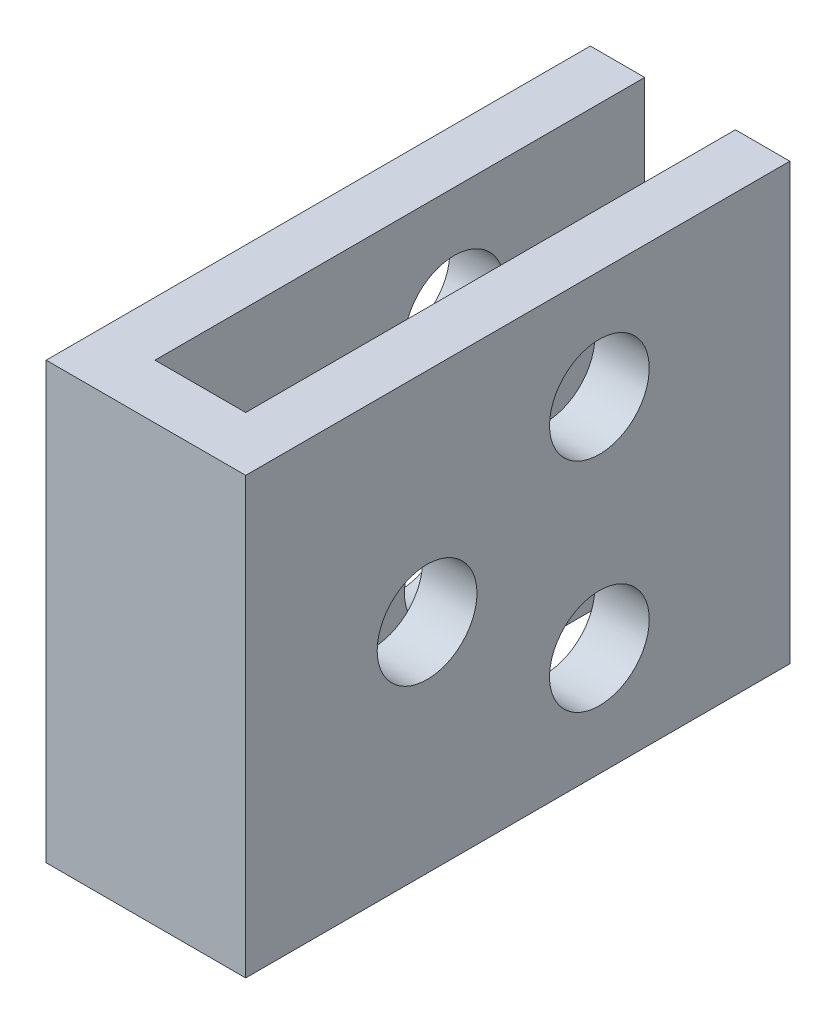
ISO-10303-21;
HEADER;
FILE_DESCRIPTION(('STEP AP214'),'2;1');
FILE_NAME('part.step','',(''),(''),'','','');
FILE_SCHEMA(('AUTOMOTIVE_DESIGN { 1 0 10303 214 1 1 1 1 }'));
ENDSEC;
DATA;
#1=APPLICATION_CONTEXT('core data for automotive mechanical design processes');
#2=APPLICATION_PROTOCOL_DEFINITION('international standard','automotive_design',2000,#1);
#3=PRODUCT_CONTEXT('',#1,'mechanical');
#4=PRODUCT('Part','Part','',(#3));
#5=PRODUCT_RELATED_PRODUCT_CATEGORY('part','',(#4));
#6=PRODUCT_DEFINITION_FORMATION('','',#4);
#7=PRODUCT_DEFINITION_CONTEXT('part definition',#1,'design');
#8=PRODUCT_DEFINITION('design','',#6,#7);
#9=PRODUCT_DEFINITION_SHAPE('','',#8);
#10=(LENGTH_UNIT() NAMED_UNIT(*) SI_UNIT(.MILLI.,.METRE.));
#11=(NAMED_UNIT(*) PLANE_ANGLE_UNIT() SI_UNIT($,.RADIAN.));
#12=(NAMED_UNIT(*) SI_UNIT($,.STERADIAN.) SOLID_ANGLE_UNIT());
#13=UNCERTAINTY_MEASURE_WITH_UNIT(LENGTH_MEASURE(1.E-05),#10,'distance_accuracy_value','');
#14=(GEOMETRIC_REPRESENTATION_CONTEXT(3) GLOBAL_UNCERTAINTY_ASSIGNED_CONTEXT((#13)) GLOBAL_UNIT_ASSIGNED_CONTEXT((#10,
#11,#12)) REPRESENTATION_CONTEXT('',''));
#15=CARTESIAN_POINT('',(0.,0.,0.));
#16=DIRECTION('',(0.,0.,1.));
#17=DIRECTION('',(1.,0.,0.));
#18=AXIS2_PLACEMENT_3D('',#15,#16,#17);
#19=CARTESIAN_POINT('',(-5.5,12.,0.));
#20=DIRECTION('',(1.,0.,0.));
#21=DIRECTION('',(0.,0.,-1.));
#22=AXIS2_PLACEMENT_3D('',#19,#20,#21);
#23=PLANE('',#22);
#24=CARTESIAN_POINT('',(-5.5,6.,-19.5));
#25=DIRECTION('',(-1.,0.,0.));
#26=DIRECTION('',(0.,0.,1.));
#27=AXIS2_PLACEMENT_3D('',#24,#25,#26);
#28=CIRCLE('',#27,2.75);
#29=CARTESIAN_POINT('',(-5.5,6.,-16.75));
#30=VERTEX_POINT('',#29);
#31=EDGE_CURVE('E171',#30,#30,#28,.T.);
#32=ORIENTED_EDGE('',*,*,#31,.F.);
#33=EDGE_LOOP('',(#32));
#34=FACE_BOUND('',#33,.T.);
#35=CARTESIAN_POINT('',(-5.5,-6.,-19.5));
#36=DIRECTION('',(-1.,0.,0.));
#37=DIRECTION('',(0.,0.,-1.));
#38=AXIS2_PLACEMENT_3D('',#35,#36,#37);
#39=CIRCLE('',#38,2.75);
#40=CARTESIAN_POINT('',(-5.5,-6.,-22.25));
#41=VERTEX_POINT('',#40);
#42=EDGE_CURVE('E181',#41,#41,#39,.T.);
#43=ORIENTED_EDGE('',*,*,#42,.F.);
#44=EDGE_LOOP('',(#43));
#45=FACE_BOUND('',#44,.T.);
#46=CARTESIAN_POINT('',(-5.5,0.,-10.));
#47=DIRECTION('',(-1.,0.,0.));
#48=DIRECTION('',(0.,0.,1.));
#49=AXIS2_PLACEMENT_3D('',#46,#47,#48);
#50=CIRCLE('',#49,2.75);
#51=CARTESIAN_POINT('',(-5.5,0.,-7.25));
#52=VERTEX_POINT('',#51);
#53=EDGE_CURVE('E187',#52,#52,#50,.T.);
#54=ORIENTED_EDGE('',*,*,#53,.F.);
#55=EDGE_LOOP('',(#54));
#56=FACE_BOUND('',#55,.T.);
#57=DIRECTION('',(0.,0.,1.));
#58=VECTOR('',#57,1.);
#59=CARTESIAN_POINT('',(-5.5,-12.,0.));
#60=LINE('',#59,#58);
#61=CARTESIAN_POINT('',(-5.5,-12.,-30.));
#62=VERTEX_POINT('',#61);
#63=CARTESIAN_POINT('',(-5.5,-12.,0.));
#64=VERTEX_POINT('',#63);
#65=EDGE_CURVE('E132',#62,#64,#60,.T.);
#66=ORIENTED_EDGE('',*,*,#65,.T.);
#67=DIRECTION('',(0.,-1.,0.));
#68=VECTOR('',#67,1.);
#69=CARTESIAN_POINT('',(-5.5,12.,0.));
#70=LINE('',#69,#68);
#71=CARTESIAN_POINT('',(-5.5,12.,0.));
#72=VERTEX_POINT('',#71);
#73=EDGE_CURVE('E11',#72,#64,#70,.T.);
#74=ORIENTED_EDGE('',*,*,#73,.F.);
#75=DIRECTION('',(0.,0.,1.));
#76=VECTOR('',#75,1.);
#77=CARTESIAN_POINT('',(-5.5,12.,0.));
#78=LINE('',#77,#76);
#79=CARTESIAN_POINT('',(-5.5,12.,-30.));
#80=VERTEX_POINT('',#79);
#81=EDGE_CURVE('E147',#80,#72,#78,.T.);
#82=ORIENTED_EDGE('',*,*,#81,.F.);
#83=DIRECTION('',(0.,-1.,0.));
#84=VECTOR('',#83,1.);
#85=CARTESIAN_POINT('',(-5.5,12.,-30.));
#86=LINE('',#85,#84);
#87=EDGE_CURVE('E128',#80,#62,#86,.T.);
#88=ORIENTED_EDGE('',*,*,#87,.T.);
#89=EDGE_LOOP('',(#66,#74,#82,#88));
#90=FACE_BOUND('',#89,.T.);
#91=ADVANCED_FACE('F34',(#34,#45,#56,#90),#23,.F.);
#92=CARTESIAN_POINT('',(5.5,12.,0.));
#93=DIRECTION('',(0.,0.,-1.));
#94=DIRECTION('',(-1.,0.,0.));
#95=AXIS2_PLACEMENT_3D('',#92,#93,#94);
#96=PLANE('',#95);
#97=DIRECTION('',(1.,0.,0.));
#98=VECTOR('',#97,1.);
#99=CARTESIAN_POINT('',(5.5,-12.,0.));
#100=LINE('',#99,#98);
#101=CARTESIAN_POINT('',(5.5,-12.,0.));
#102=VERTEX_POINT('',#101);
#103=EDGE_CURVE('E135',#64,#102,#100,.T.);
#104=ORIENTED_EDGE('',*,*,#103,.T.);
#105=DIRECTION('',(0.,-1.,0.));
#106=VECTOR('',#105,1.);
#107=CARTESIAN_POINT('',(5.5,12.,0.));
#108=LINE('',#107,#106);
#109=CARTESIAN_POINT('',(5.5,12.,0.));
#110=VERTEX_POINT('',#109);
#111=EDGE_CURVE('E43',#110,#102,#108,.T.);
#112=ORIENTED_EDGE('',*,*,#111,.F.);
#113=DIRECTION('',(1.,0.,0.));
#114=VECTOR('',#113,1.);
#115=CARTESIAN_POINT('',(5.5,12.,0.));
#116=LINE('',#115,#114);
#117=EDGE_CURVE('E95',#72,#110,#116,.T.);
#118=ORIENTED_EDGE('',*,*,#117,.F.);
#119=ORIENTED_EDGE('',*,*,#73,.T.);
#120=EDGE_LOOP('',(#104,#112,#118,#119));
#121=FACE_BOUND('',#120,.T.);
#122=ADVANCED_FACE('F228',(#121),#96,.F.);
#123=CARTESIAN_POINT('',(5.5,12.,0.));
#124=DIRECTION('',(-1.,0.,0.));
#125=DIRECTION('',(0.,0.,1.));
#126=AXIS2_PLACEMENT_3D('',#123,#124,#125);
#127=PLANE('',#126);
#128=CARTESIAN_POINT('',(5.5,6.,-19.5));
#129=DIRECTION('',(-1.,0.,0.));
#130=DIRECTION('',(0.,0.,1.));
#131=AXIS2_PLACEMENT_3D('',#128,#129,#130);
#132=CIRCLE('',#131,2.75);
#133=CARTESIAN_POINT('',(5.5,6.,-16.75));
#134=VERTEX_POINT('',#133);
#135=EDGE_CURVE('E165',#134,#134,#132,.T.);
#136=ORIENTED_EDGE('',*,*,#135,.T.);
#137=EDGE_LOOP('',(#136));
#138=FACE_BOUND('',#137,.T.);
#139=CARTESIAN_POINT('',(5.5,-6.,-19.5));
#140=DIRECTION('',(-1.,0.,0.));
#141=DIRECTION('',(0.,0.,-1.));
#142=AXIS2_PLACEMENT_3D('',#139,#140,#141);
#143=CIRCLE('',#142,2.75);
#144=CARTESIAN_POINT('',(5.5,-6.,-22.25));
#145=VERTEX_POINT('',#144);
#146=EDGE_CURVE('E176',#145,#145,#143,.T.);
#147=ORIENTED_EDGE('',*,*,#146,.T.);
#148=EDGE_LOOP('',(#147));
#149=FACE_BOUND('',#148,.T.);
#150=CARTESIAN_POINT('',(5.5,0.,-10.));
#151=DIRECTION('',(-1.,0.,0.));
#152=DIRECTION('',(0.,0.,1.));
#153=AXIS2_PLACEMENT_3D('',#150,#151,#152);
#154=CIRCLE('',#153,2.75);
#155=CARTESIAN_POINT('',(5.5,0.,-7.25));
#156=VERTEX_POINT('',#155);
#157=EDGE_CURVE('E161',#156,#156,#154,.T.);
#158=ORIENTED_EDGE('',*,*,#157,.T.);
#159=EDGE_LOOP('',(#158));
#160=FACE_BOUND('',#159,.T.);
#161=DIRECTION('',(0.,0.,-1.));
#162=VECTOR('',#161,1.);
#163=CARTESIAN_POINT('',(5.5,-12.,0.));
#164=LINE('',#163,#162);
#165=CARTESIAN_POINT('',(5.49999999999999,-12.,-30.));
#166=VERTEX_POINT('',#165);
#167=EDGE_CURVE('E138',#102,#166,#164,.T.);
#168=ORIENTED_EDGE('',*,*,#167,.T.);
#169=DIRECTION('',(0.,-1.,0.));
#170=VECTOR('',#169,1.);
#171=CARTESIAN_POINT('',(5.49999999999999,12.,-30.));
#172=LINE('',#171,#170);
#173=CARTESIAN_POINT('',(5.49999999999999,12.,-30.));
#174=VERTEX_POINT('',#173);
#175=EDGE_CURVE('E154',#174,#166,#172,.T.);
#176=ORIENTED_EDGE('',*,*,#175,.F.);
#177=DIRECTION('',(0.,0.,-1.));
#178=VECTOR('',#177,1.);
#179=CARTESIAN_POINT('',(5.5,12.,0.));
#180=LINE('',#179,#178);
#181=EDGE_CURVE('E196',#110,#174,#180,.T.);
#182=ORIENTED_EDGE('',*,*,#181,.F.);
#183=ORIENTED_EDGE('',*,*,#111,.T.);
#184=EDGE_LOOP('',(#168,#176,#182,#183));
#185=FACE_BOUND('',#184,.T.);
#186=ADVANCED_FACE('F233',(#138,#149,#160,#185),#127,.F.);
#187=CARTESIAN_POINT('',(5.49999999999999,12.,-30.));
#188=DIRECTION('',(0.,0.,1.));
#189=DIRECTION('',(1.,0.,0.));
#190=AXIS2_PLACEMENT_3D('',#187,#188,#189);
#191=PLANE('',#190);
#192=DIRECTION('',(-1.,0.,0.));
#193=VECTOR('',#192,1.);
#194=CARTESIAN_POINT('',(5.49999999999999,-12.,-30.));
#195=LINE('',#194,#193);
#196=CARTESIAN_POINT('',(2.5,-12.,-30.));
#197=VERTEX_POINT('',#196);
#198=EDGE_CURVE('E140',#166,#197,#195,.T.);
#199=ORIENTED_EDGE('',*,*,#198,.T.);
#200=DIRECTION('',(0.,-1.,0.));
#201=VECTOR('',#200,1.);
#202=CARTESIAN_POINT('',(2.5,12.,-30.));
#203=LINE('',#202,#201);
#204=CARTESIAN_POINT('',(2.5,12.,-30.));
#205=VERTEX_POINT('',#204);
#206=EDGE_CURVE('E151',#205,#197,#203,.T.);
#207=ORIENTED_EDGE('',*,*,#206,.F.);
#208=DIRECTION('',(-1.,0.,0.));
#209=VECTOR('',#208,1.);
#210=CARTESIAN_POINT('',(5.49999999999999,12.,-30.));
#211=LINE('',#210,#209);
#212=EDGE_CURVE('E198',#174,#205,#211,.T.);
#213=ORIENTED_EDGE('',*,*,#212,.F.);
#214=ORIENTED_EDGE('',*,*,#175,.T.);
#215=EDGE_LOOP('',(#199,#207,#213,#214));
#216=FACE_BOUND('',#215,.T.);
#217=ADVANCED_FACE('F204',(#216),#191,.F.);
#218=CARTESIAN_POINT('',(2.5,12.,-30.));
#219=DIRECTION('',(1.,0.,0.));
#220=DIRECTION('',(0.,0.,-1.));
#221=AXIS2_PLACEMENT_3D('',#218,#219,#220);
#222=PLANE('',#221);
#223=CARTESIAN_POINT('',(2.5,6.,-19.5));
#224=DIRECTION('',(1.,0.,0.));
#225=DIRECTION('',(0.,0.,-1.));
#226=AXIS2_PLACEMENT_3D('',#223,#224,#225);
#227=CIRCLE('',#226,2.75);
#228=CARTESIAN_POINT('',(2.5,6.,-22.25));
#229=VERTEX_POINT('',#228);
#230=EDGE_CURVE('E184',#229,#229,#227,.T.);
#231=ORIENTED_EDGE('',*,*,#230,.T.);
#232=EDGE_LOOP('',(#231));
#233=FACE_BOUND('',#232,.T.);
#234=CARTESIAN_POINT('',(2.5,-6.,-19.5));
#235=DIRECTION('',(1.,0.,0.));
#236=DIRECTION('',(0.,0.,-1.));
#237=AXIS2_PLACEMENT_3D('',#234,#235,#236);
#238=CIRCLE('',#237,2.75);
#239=CARTESIAN_POINT('',(2.5,-6.,-22.25));
#240=VERTEX_POINT('',#239);
#241=EDGE_CURVE('E164',#240,#240,#238,.T.);
#242=ORIENTED_EDGE('',*,*,#241,.T.);
#243=EDGE_LOOP('',(#242));
#244=FACE_BOUND('',#243,.T.);
#245=CARTESIAN_POINT('',(2.5,0.,-10.));
#246=DIRECTION('',(1.,0.,0.));
#247=DIRECTION('',(0.,0.,-1.));
#248=AXIS2_PLACEMENT_3D('',#245,#246,#247);
#249=CIRCLE('',#248,2.75);
#250=CARTESIAN_POINT('',(2.5,0.,-12.75));
#251=VERTEX_POINT('',#250);
#252=EDGE_CURVE('E136',#251,#251,#249,.T.);
#253=ORIENTED_EDGE('',*,*,#252,.T.);
#254=EDGE_LOOP('',(#253));
#255=FACE_BOUND('',#254,.T.);
#256=DIRECTION('',(0.,0.,1.));
#257=VECTOR('',#256,1.);
#258=CARTESIAN_POINT('',(2.5,-12.,-30.));
#259=LINE('',#258,#257);
#260=CARTESIAN_POINT('',(2.5,-12.,-3.));
#261=VERTEX_POINT('',#260);
#262=EDGE_CURVE('E142',#197,#261,#259,.T.);
#263=ORIENTED_EDGE('',*,*,#262,.T.);
#264=DIRECTION('',(0.,-1.,0.));
#265=VECTOR('',#264,1.);
#266=CARTESIAN_POINT('',(2.5,12.,-3.));
#267=LINE('',#266,#265);
#268=CARTESIAN_POINT('',(2.5,12.,-3.));
#269=VERTEX_POINT('',#268);
#270=EDGE_CURVE('E123',#269,#261,#267,.T.);
#271=ORIENTED_EDGE('',*,*,#270,.F.);
#272=DIRECTION('',(0.,0.,1.));
#273=VECTOR('',#272,1.);
#274=CARTESIAN_POINT('',(2.5,12.,-30.));
#275=LINE('',#274,#273);
#276=EDGE_CURVE('E114',#205,#269,#275,.T.);
#277=ORIENTED_EDGE('',*,*,#276,.F.);
#278=ORIENTED_EDGE('',*,*,#206,.T.);
#279=EDGE_LOOP('',(#263,#271,#277,#278));
#280=FACE_BOUND('',#279,.T.);
#281=ADVANCED_FACE('F208',(#233,#244,#255,#280),#222,.F.);
#282=CARTESIAN_POINT('',(-2.5,12.,-3.));
#283=DIRECTION('',(0.,0.,1.));
#284=DIRECTION('',(1.,0.,0.));
#285=AXIS2_PLACEMENT_3D('',#282,#283,#284);
#286=PLANE('',#285);
#287=DIRECTION('',(-1.,0.,0.));
#288=VECTOR('',#287,1.);
#289=CARTESIAN_POINT('',(-2.5,-12.,-3.));
#290=LINE('',#289,#288);
#291=CARTESIAN_POINT('',(-2.5,-12.,-3.));
#292=VERTEX_POINT('',#291);
#293=EDGE_CURVE('E122',#261,#292,#290,.T.);
#294=ORIENTED_EDGE('',*,*,#293,.T.);
#295=DIRECTION('',(0.,-1.,0.));
#296=VECTOR('',#295,1.);
#297=CARTESIAN_POINT('',(-2.5,12.,-3.));
#298=LINE('',#297,#296);
#299=CARTESIAN_POINT('',(-2.5,12.,-3.));
#300=VERTEX_POINT('',#299);
#301=EDGE_CURVE('E119',#300,#292,#298,.T.);
#302=ORIENTED_EDGE('',*,*,#301,.F.);
#303=DIRECTION('',(-1.,0.,0.));
#304=VECTOR('',#303,1.);
#305=CARTESIAN_POINT('',(-2.5,12.,-3.));
#306=LINE('',#305,#304);
#307=EDGE_CURVE('E108',#269,#300,#306,.T.);
#308=ORIENTED_EDGE('',*,*,#307,.F.);
#309=ORIENTED_EDGE('',*,*,#270,.T.);
#310=EDGE_LOOP('',(#294,#302,#308,#309));
#311=FACE_BOUND('',#310,.T.);
#312=ADVANCED_FACE('F120',(#311),#286,.F.);
#313=CARTESIAN_POINT('',(-2.5,12.,-30.));
#314=DIRECTION('',(-1.,0.,0.));
#315=DIRECTION('',(0.,0.,1.));
#316=AXIS2_PLACEMENT_3D('',#313,#314,#315);
#317=PLANE('',#316);
#318=CARTESIAN_POINT('',(-2.5,6.,-19.5));
#319=DIRECTION('',(-1.,0.,0.));
#320=DIRECTION('',(0.,0.,1.));
#321=AXIS2_PLACEMENT_3D('',#318,#319,#320);
#322=CIRCLE('',#321,2.75);
#323=CARTESIAN_POINT('',(-2.5,6.,-16.75));
#324=VERTEX_POINT('',#323);
#325=EDGE_CURVE('E37',#324,#324,#322,.T.);
#326=ORIENTED_EDGE('',*,*,#325,.T.);
#327=EDGE_LOOP('',(#326));
#328=FACE_BOUND('',#327,.T.);
#329=CARTESIAN_POINT('',(-2.5,-6.,-19.5));
#330=DIRECTION('',(-1.,0.,0.));
#331=DIRECTION('',(0.,0.,1.));
#332=AXIS2_PLACEMENT_3D('',#329,#330,#331);
#333=CIRCLE('',#332,2.75);
#334=CARTESIAN_POINT('',(-2.5,-6.,-16.75));
#335=VERTEX_POINT('',#334);
#336=EDGE_CURVE('E162',#335,#335,#333,.T.);
#337=ORIENTED_EDGE('',*,*,#336,.T.);
#338=EDGE_LOOP('',(#337));
#339=FACE_BOUND('',#338,.T.);
#340=CARTESIAN_POINT('',(-2.5,0.,-10.));
#341=DIRECTION('',(-1.,0.,0.));
#342=DIRECTION('',(0.,0.,1.));
#343=AXIS2_PLACEMENT_3D('',#340,#341,#342);
#344=CIRCLE('',#343,2.75);
#345=CARTESIAN_POINT('',(-2.5,0.,-7.25));
#346=VERTEX_POINT('',#345);
#347=EDGE_CURVE('E159',#346,#346,#344,.T.);
#348=ORIENTED_EDGE('',*,*,#347,.T.);
#349=EDGE_LOOP('',(#348));
#350=FACE_BOUND('',#349,.T.);
#351=DIRECTION('',(0.,0.,-1.));
#352=VECTOR('',#351,1.);
#353=CARTESIAN_POINT('',(-2.5,-12.,-30.));
#354=LINE('',#353,#352);
#355=CARTESIAN_POINT('',(-2.5,-12.,-30.));
#356=VERTEX_POINT('',#355);
#357=EDGE_CURVE('E81',#292,#356,#354,.T.);
#358=ORIENTED_EDGE('',*,*,#357,.T.);
#359=DIRECTION('',(0.,-1.,0.));
#360=VECTOR('',#359,1.);
#361=CARTESIAN_POINT('',(-2.5,12.,-30.));
#362=LINE('',#361,#360);
#363=CARTESIAN_POINT('',(-2.5,12.,-30.));
#364=VERTEX_POINT('',#363);
#365=EDGE_CURVE('E124',#364,#356,#362,.T.);
#366=ORIENTED_EDGE('',*,*,#365,.F.);
#367=DIRECTION('',(0.,0.,-1.));
#368=VECTOR('',#367,1.);
#369=CARTESIAN_POINT('',(-2.5,12.,-30.));
#370=LINE('',#369,#368);
#371=EDGE_CURVE('E112',#300,#364,#370,.T.);
#372=ORIENTED_EDGE('',*,*,#371,.F.);
#373=ORIENTED_EDGE('',*,*,#301,.T.);
#374=EDGE_LOOP('',(#358,#366,#372,#373));
#375=FACE_BOUND('',#374,.T.);
#376=ADVANCED_FACE('F126',(#328,#339,#350,#375),#317,.F.);
#377=CARTESIAN_POINT('',(-5.5,12.,-30.));
#378=DIRECTION('',(0.,0.,1.));
#379=DIRECTION('',(1.,0.,0.));
#380=AXIS2_PLACEMENT_3D('',#377,#378,#379);
#381=PLANE('',#380);
#382=DIRECTION('',(-1.,0.,0.));
#383=VECTOR('',#382,1.);
#384=CARTESIAN_POINT('',(-5.5,-12.,-30.));
#385=LINE('',#384,#383);
#386=EDGE_CURVE('E87',#356,#62,#385,.T.);
#387=ORIENTED_EDGE('',*,*,#386,.T.);
#388=ORIENTED_EDGE('',*,*,#87,.F.);
#389=DIRECTION('',(-1.,0.,0.));
#390=VECTOR('',#389,1.);
#391=CARTESIAN_POINT('',(-5.5,12.,-30.));
#392=LINE('',#391,#390);
#393=EDGE_CURVE('E52',#364,#80,#392,.T.);
#394=ORIENTED_EDGE('',*,*,#393,.F.);
#395=ORIENTED_EDGE('',*,*,#365,.T.);
#396=EDGE_LOOP('',(#387,#388,#394,#395));
#397=FACE_BOUND('',#396,.T.);
#398=ADVANCED_FACE('F216',(#397),#381,.F.);
#399=CARTESIAN_POINT('',(0.,12.,0.));
#400=DIRECTION('',(0.,-1.,0.));
#401=DIRECTION('',(0.,0.,-1.));
#402=AXIS2_PLACEMENT_3D('',#399,#400,#401);
#403=PLANE('',#402);
#404=ORIENTED_EDGE('',*,*,#81,.T.);
#405=ORIENTED_EDGE('',*,*,#117,.T.);
#406=ORIENTED_EDGE('',*,*,#181,.T.);
#407=ORIENTED_EDGE('',*,*,#212,.T.);
#408=ORIENTED_EDGE('',*,*,#276,.T.);
#409=ORIENTED_EDGE('',*,*,#307,.T.);
#410=ORIENTED_EDGE('',*,*,#371,.T.);
#411=ORIENTED_EDGE('',*,*,#393,.T.);
#412=EDGE_LOOP('',(#404,#405,#406,#407,#408,#409,#410,#411));
#413=FACE_BOUND('',#412,.T.);
#414=ADVANCED_FACE('F110',(#413),#403,.F.);
#415=CARTESIAN_POINT('',(0.,-12.,0.));
#416=DIRECTION('',(0.,-1.,0.));
#417=DIRECTION('',(0.,0.,-1.));
#418=AXIS2_PLACEMENT_3D('',#415,#416,#417);
#419=PLANE('',#418);
#420=ORIENTED_EDGE('',*,*,#65,.F.);
#421=ORIENTED_EDGE('',*,*,#386,.F.);
#422=ORIENTED_EDGE('',*,*,#357,.F.);
#423=ORIENTED_EDGE('',*,*,#293,.F.);
#424=ORIENTED_EDGE('',*,*,#262,.F.);
#425=ORIENTED_EDGE('',*,*,#198,.F.);
#426=ORIENTED_EDGE('',*,*,#167,.F.);
#427=ORIENTED_EDGE('',*,*,#103,.F.);
#428=EDGE_LOOP('',(#420,#421,#422,#423,#424,#425,#426,#427));
#429=FACE_BOUND('',#428,.T.);
#430=ADVANCED_FACE('F211',(#429),#419,.T.);
#431=CARTESIAN_POINT('',(5.5,0.,-10.));
#432=DIRECTION('',(-1.,0.,0.));
#433=DIRECTION('',(0.,0.,1.));
#434=AXIS2_PLACEMENT_3D('',#431,#432,#433);
#435=CYLINDRICAL_SURFACE('',#434,2.75);
#436=ORIENTED_EDGE('',*,*,#53,.T.);
#437=EDGE_LOOP('',(#436));
#438=FACE_BOUND('',#437,.T.);
#439=ORIENTED_EDGE('',*,*,#347,.F.);
#440=EDGE_LOOP('',(#439));
#441=FACE_BOUND('',#440,.T.);
#442=ADVANCED_FACE('F240',(#438,#441),#435,.F.);
#443=ORIENTED_EDGE('',*,*,#157,.F.);
#444=EDGE_LOOP('',(#443));
#445=FACE_BOUND('',#444,.T.);
#446=ORIENTED_EDGE('',*,*,#252,.F.);
#447=EDGE_LOOP('',(#446));
#448=FACE_BOUND('',#447,.T.);
#449=ADVANCED_FACE('F243',(#445,#448),#435,.F.);
#450=CARTESIAN_POINT('',(5.5,-6.,-19.5));
#451=DIRECTION('',(-1.,0.,0.));
#452=DIRECTION('',(0.,0.,1.));
#453=AXIS2_PLACEMENT_3D('',#450,#451,#452);
#454=CYLINDRICAL_SURFACE('',#453,2.75);
#455=ORIENTED_EDGE('',*,*,#42,.T.);
#456=EDGE_LOOP('',(#455));
#457=FACE_BOUND('',#456,.T.);
#458=ORIENTED_EDGE('',*,*,#336,.F.);
#459=EDGE_LOOP('',(#458));
#460=FACE_BOUND('',#459,.T.);
#461=ADVANCED_FACE('F251',(#457,#460),#454,.F.);
#462=CARTESIAN_POINT('',(5.5,6.,-19.5));
#463=DIRECTION('',(-1.,0.,0.));
#464=DIRECTION('',(0.,0.,1.));
#465=AXIS2_PLACEMENT_3D('',#462,#463,#464);
#466=CYLINDRICAL_SURFACE('',#465,2.75);
#467=ORIENTED_EDGE('',*,*,#31,.T.);
#468=EDGE_LOOP('',(#467));
#469=FACE_BOUND('',#468,.T.);
#470=ORIENTED_EDGE('',*,*,#325,.F.);
#471=EDGE_LOOP('',(#470));
#472=FACE_BOUND('',#471,.T.);
#473=ADVANCED_FACE('F258',(#469,#472),#466,.F.);
#474=ORIENTED_EDGE('',*,*,#146,.F.);
#475=EDGE_LOOP('',(#474));
#476=FACE_BOUND('',#475,.T.);
#477=ORIENTED_EDGE('',*,*,#241,.F.);
#478=EDGE_LOOP('',(#477));
#479=FACE_BOUND('',#478,.T.);
#480=ADVANCED_FACE('F254',(#476,#479),#454,.F.);
#481=ORIENTED_EDGE('',*,*,#135,.F.);
#482=EDGE_LOOP('',(#481));
#483=FACE_BOUND('',#482,.T.);
#484=ORIENTED_EDGE('',*,*,#230,.F.);
#485=EDGE_LOOP('',(#484));
#486=FACE_BOUND('',#485,.T.);
#487=ADVANCED_FACE('F257',(#483,#486),#466,.F.);
#488=CLOSED_SHELL('',(#91,#122,#186,#217,#281,#312,#376,#398,#414,#430,#442,#449,#461,#473,#480,#487));
#489=MANIFOLD_SOLID_BREP('B2',#488);
#490=ADVANCED_BREP_SHAPE_REPRESENTATION('',(#18,#489),#14);
#491=SHAPE_DEFINITION_REPRESENTATION(#9,#490);
ENDSEC;
END-ISO-10303-21;
